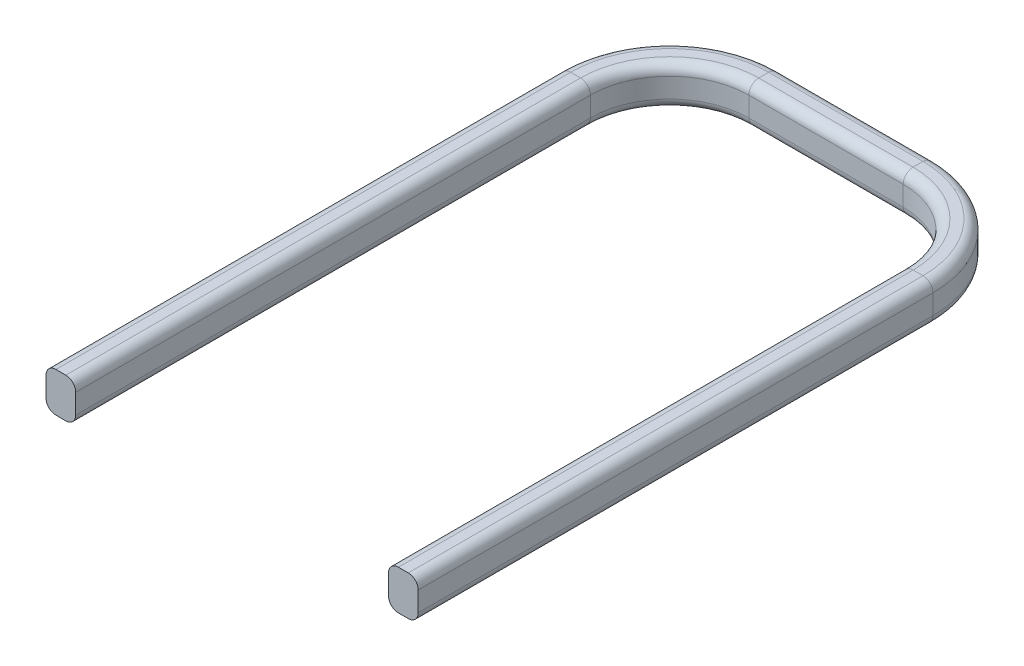
ISO-10303-21;
HEADER;
FILE_DESCRIPTION(('STEP AP214'),'2;1');
FILE_NAME('part.step','',(''),(''),'','','');
FILE_SCHEMA(('AUTOMOTIVE_DESIGN { 1 0 10303 214 1 1 1 1 }'));
ENDSEC;
DATA;
#1=APPLICATION_CONTEXT('core data for automotive mechanical design processes');
#2=APPLICATION_PROTOCOL_DEFINITION('international standard','automotive_design',2000,#1);
#3=PRODUCT_CONTEXT('',#1,'mechanical');
#4=PRODUCT('Part','Part','',(#3));
#5=PRODUCT_RELATED_PRODUCT_CATEGORY('part','',(#4));
#6=PRODUCT_DEFINITION_FORMATION('','',#4);
#7=PRODUCT_DEFINITION_CONTEXT('part definition',#1,'design');
#8=PRODUCT_DEFINITION('design','',#6,#7);
#9=PRODUCT_DEFINITION_SHAPE('','',#8);
#10=(LENGTH_UNIT() NAMED_UNIT(*) SI_UNIT(.MILLI.,.METRE.));
#11=(NAMED_UNIT(*) PLANE_ANGLE_UNIT() SI_UNIT($,.RADIAN.));
#12=(NAMED_UNIT(*) SI_UNIT($,.STERADIAN.) SOLID_ANGLE_UNIT());
#13=UNCERTAINTY_MEASURE_WITH_UNIT(LENGTH_MEASURE(1.E-05),#10,'distance_accuracy_value','');
#14=(GEOMETRIC_REPRESENTATION_CONTEXT(3) GLOBAL_UNCERTAINTY_ASSIGNED_CONTEXT((#13)) GLOBAL_UNIT_ASSIGNED_CONTEXT((#10,
#11,#12)) REPRESENTATION_CONTEXT('',''));
#15=CARTESIAN_POINT('',(0.,0.,0.));
#16=DIRECTION('',(0.,0.,1.));
#17=DIRECTION('',(1.,0.,0.));
#18=AXIS2_PLACEMENT_3D('',#15,#16,#17);
#19=CARTESIAN_POINT('',(0.,0.,0.));
#20=DIRECTION('',(0.,0.,1.));
#21=DIRECTION('',(1.,0.,0.));
#22=AXIS2_PLACEMENT_3D('',#19,#20,#21);
#23=PLANE('',#22);
#24=DIRECTION('',(0.,-1.,0.));
#25=VECTOR('',#24,1.);
#26=CARTESIAN_POINT('',(-4.7,0.,0.));
#27=LINE('',#26,#25);
#28=CARTESIAN_POINT('',(-4.7,0.75,0.));
#29=VERTEX_POINT('',#28);
#30=CARTESIAN_POINT('',(-4.7,0.25,0.));
#31=VERTEX_POINT('',#30);
#32=EDGE_CURVE('E485',#29,#31,#27,.T.);
#33=ORIENTED_EDGE('',*,*,#32,.T.);
#34=CARTESIAN_POINT('',(-4.45,0.25,0.));
#35=DIRECTION('',(0.,0.,1.));
#36=DIRECTION('',(1.,0.,0.));
#37=AXIS2_PLACEMENT_3D('',#34,#35,#36);
#38=CIRCLE('',#37,0.25);
#39=CARTESIAN_POINT('',(-4.45,0.,0.));
#40=VERTEX_POINT('',#39);
#41=EDGE_CURVE('E295',#31,#40,#38,.T.);
#42=ORIENTED_EDGE('',*,*,#41,.T.);
#43=DIRECTION('',(1.,0.,0.));
#44=VECTOR('',#43,1.);
#45=CARTESIAN_POINT('',(-3.95,0.,0.));
#46=LINE('',#45,#44);
#47=CARTESIAN_POINT('',(-4.2,0.,0.));
#48=VERTEX_POINT('',#47);
#49=EDGE_CURVE('E236',#40,#48,#46,.T.);
#50=ORIENTED_EDGE('',*,*,#49,.T.);
#51=CARTESIAN_POINT('',(-4.2,0.25,0.));
#52=DIRECTION('',(0.,0.,1.));
#53=DIRECTION('',(1.,0.,0.));
#54=AXIS2_PLACEMENT_3D('',#51,#52,#53);
#55=CIRCLE('',#54,0.25);
#56=CARTESIAN_POINT('',(-3.95,0.25,0.));
#57=VERTEX_POINT('',#56);
#58=EDGE_CURVE('E292',#48,#57,#55,.T.);
#59=ORIENTED_EDGE('',*,*,#58,.T.);
#60=DIRECTION('',(0.,1.,0.));
#61=VECTOR('',#60,1.);
#62=CARTESIAN_POINT('',(-3.95,0.,0.));
#63=LINE('',#62,#61);
#64=CARTESIAN_POINT('',(-3.95,0.75,0.));
#65=VERTEX_POINT('',#64);
#66=EDGE_CURVE('E421',#57,#65,#63,.T.);
#67=ORIENTED_EDGE('',*,*,#66,.T.);
#68=CARTESIAN_POINT('',(-4.2,0.75,0.));
#69=DIRECTION('',(0.,0.,1.));
#70=DIRECTION('',(1.,0.,0.));
#71=AXIS2_PLACEMENT_3D('',#68,#69,#70);
#72=CIRCLE('',#71,0.25);
#73=CARTESIAN_POINT('',(-4.2,1.,0.));
#74=VERTEX_POINT('',#73);
#75=EDGE_CURVE('E289',#65,#74,#72,.T.);
#76=ORIENTED_EDGE('',*,*,#75,.T.);
#77=DIRECTION('',(-1.,0.,0.));
#78=VECTOR('',#77,1.);
#79=CARTESIAN_POINT('',(-3.95,1.,0.));
#80=LINE('',#79,#78);
#81=CARTESIAN_POINT('',(-4.45,1.,0.));
#82=VERTEX_POINT('',#81);
#83=EDGE_CURVE('E478',#74,#82,#80,.T.);
#84=ORIENTED_EDGE('',*,*,#83,.T.);
#85=CARTESIAN_POINT('',(-4.45,0.75,0.));
#86=DIRECTION('',(0.,0.,1.));
#87=DIRECTION('',(1.,0.,0.));
#88=AXIS2_PLACEMENT_3D('',#85,#86,#87);
#89=CIRCLE('',#88,0.25);
#90=EDGE_CURVE('E286',#82,#29,#89,.T.);
#91=ORIENTED_EDGE('',*,*,#90,.T.);
#92=EDGE_LOOP('',(#33,#42,#50,#59,#67,#76,#84,#91));
#93=FACE_BOUND('',#92,.T.);
#94=ADVANCED_FACE('F39',(#93),#23,.T.);
#95=CARTESIAN_POINT('',(0.,0.,0.));
#96=DIRECTION('',(0.,0.,-1.));
#97=DIRECTION('',(-1.,0.,0.));
#98=AXIS2_PLACEMENT_3D('',#95,#96,#97);
#99=PLANE('',#98);
#100=DIRECTION('',(1.,0.,0.));
#101=VECTOR('',#100,1.);
#102=CARTESIAN_POINT('',(3.95,1.,0.));
#103=LINE('',#102,#101);
#104=CARTESIAN_POINT('',(4.2,1.,0.));
#105=VERTEX_POINT('',#104);
#106=CARTESIAN_POINT('',(4.45,1.,0.));
#107=VERTEX_POINT('',#106);
#108=EDGE_CURVE('E507',#105,#107,#103,.T.);
#109=ORIENTED_EDGE('',*,*,#108,.F.);
#110=CARTESIAN_POINT('',(4.2,0.75,0.));
#111=DIRECTION('',(0.,0.,-1.));
#112=DIRECTION('',(-1.,0.,0.));
#113=AXIS2_PLACEMENT_3D('',#110,#111,#112);
#114=CIRCLE('',#113,0.25);
#115=CARTESIAN_POINT('',(3.95,0.75,0.));
#116=VERTEX_POINT('',#115);
#117=EDGE_CURVE('E370',#105,#116,#114,.F.);
#118=ORIENTED_EDGE('',*,*,#117,.T.);
#119=DIRECTION('',(0.,1.,0.));
#120=VECTOR('',#119,1.);
#121=CARTESIAN_POINT('',(3.95,0.,0.));
#122=LINE('',#121,#120);
#123=CARTESIAN_POINT('',(3.95,0.25,0.));
#124=VERTEX_POINT('',#123);
#125=EDGE_CURVE('E273',#124,#116,#122,.T.);
#126=ORIENTED_EDGE('',*,*,#125,.F.);
#127=CARTESIAN_POINT('',(4.2,0.25,0.));
#128=DIRECTION('',(0.,0.,-1.));
#129=DIRECTION('',(-1.,0.,0.));
#130=AXIS2_PLACEMENT_3D('',#127,#128,#129);
#131=CIRCLE('',#130,0.25);
#132=CARTESIAN_POINT('',(4.2,0.,0.));
#133=VERTEX_POINT('',#132);
#134=EDGE_CURVE('E361',#124,#133,#131,.F.);
#135=ORIENTED_EDGE('',*,*,#134,.T.);
#136=DIRECTION('',(-1.,0.,0.));
#137=VECTOR('',#136,1.);
#138=CARTESIAN_POINT('',(3.95,0.,0.));
#139=LINE('',#138,#137);
#140=CARTESIAN_POINT('',(4.45,0.,0.));
#141=VERTEX_POINT('',#140);
#142=EDGE_CURVE('E275',#141,#133,#139,.T.);
#143=ORIENTED_EDGE('',*,*,#142,.F.);
#144=CARTESIAN_POINT('',(4.45,0.25,0.));
#145=DIRECTION('',(0.,0.,-1.));
#146=DIRECTION('',(-1.,0.,0.));
#147=AXIS2_PLACEMENT_3D('',#144,#145,#146);
#148=CIRCLE('',#147,0.25);
#149=CARTESIAN_POINT('',(4.7,0.25,0.));
#150=VERTEX_POINT('',#149);
#151=EDGE_CURVE('E364',#141,#150,#148,.F.);
#152=ORIENTED_EDGE('',*,*,#151,.T.);
#153=DIRECTION('',(0.,-1.,0.));
#154=VECTOR('',#153,1.);
#155=CARTESIAN_POINT('',(4.7,0.,0.));
#156=LINE('',#155,#154);
#157=CARTESIAN_POINT('',(4.7,0.75,0.));
#158=VERTEX_POINT('',#157);
#159=EDGE_CURVE('E279',#158,#150,#156,.T.);
#160=ORIENTED_EDGE('',*,*,#159,.F.);
#161=CARTESIAN_POINT('',(4.45,0.75,0.));
#162=DIRECTION('',(0.,0.,-1.));
#163=DIRECTION('',(-1.,0.,0.));
#164=AXIS2_PLACEMENT_3D('',#161,#162,#163);
#165=CIRCLE('',#164,0.25);
#166=EDGE_CURVE('E367',#158,#107,#165,.F.);
#167=ORIENTED_EDGE('',*,*,#166,.T.);
#168=EDGE_LOOP('',(#109,#118,#126,#135,#143,#152,#160,#167));
#169=FACE_BOUND('',#168,.T.);
#170=ADVANCED_FACE('F556',(#169),#99,.F.);
#171=CARTESIAN_POINT('',(-3.95,0.,0.));
#172=DIRECTION('',(-1.,0.,0.));
#173=DIRECTION('',(0.,0.,1.));
#174=AXIS2_PLACEMENT_3D('',#171,#172,#173);
#175=PLANE('',#174);
#176=ORIENTED_EDGE('',*,*,#66,.F.);
#177=DIRECTION('',(0.,0.,-1.));
#178=VECTOR('',#177,1.);
#179=CARTESIAN_POINT('',(-3.95,0.25,0.));
#180=LINE('',#179,#178);
#181=CARTESIAN_POINT('',(-3.95,0.25,-13.));
#182=VERTEX_POINT('',#181);
#183=EDGE_CURVE('E332',#57,#182,#180,.T.);
#184=ORIENTED_EDGE('',*,*,#183,.T.);
#185=DIRECTION('',(0.,1.,0.));
#186=VECTOR('',#185,1.);
#187=CARTESIAN_POINT('',(-3.95,0.,-13.));
#188=LINE('',#187,#186);
#189=CARTESIAN_POINT('',(-3.95,0.75,-13.));
#190=VERTEX_POINT('',#189);
#191=EDGE_CURVE('E496',#182,#190,#188,.T.);
#192=ORIENTED_EDGE('',*,*,#191,.T.);
#193=DIRECTION('',(0.,0.,-1.));
#194=VECTOR('',#193,1.);
#195=CARTESIAN_POINT('',(-3.95,0.75,0.));
#196=LINE('',#195,#194);
#197=EDGE_CURVE('E329',#190,#65,#196,.F.);
#198=ORIENTED_EDGE('',*,*,#197,.T.);
#199=EDGE_LOOP('',(#176,#184,#192,#198));
#200=FACE_BOUND('',#199,.T.);
#201=ADVANCED_FACE('F595',(#200),#175,.F.);
#202=CARTESIAN_POINT('',(-3.95,1.,0.));
#203=DIRECTION('',(0.,-1.,0.));
#204=DIRECTION('',(1.,0.,0.));
#205=AXIS2_PLACEMENT_3D('',#202,#203,#204);
#206=PLANE('',#205);
#207=ORIENTED_EDGE('',*,*,#83,.F.);
#208=DIRECTION('',(0.,0.,-1.));
#209=VECTOR('',#208,1.);
#210=CARTESIAN_POINT('',(-4.2,1.,0.));
#211=LINE('',#210,#209);
#212=CARTESIAN_POINT('',(-4.2,1.,-13.));
#213=VERTEX_POINT('',#212);
#214=EDGE_CURVE('E11',#74,#213,#211,.T.);
#215=ORIENTED_EDGE('',*,*,#214,.T.);
#216=DIRECTION('',(-1.,0.,0.));
#217=VECTOR('',#216,1.);
#218=CARTESIAN_POINT('',(-3.95,1.,-13.));
#219=LINE('',#218,#217);
#220=CARTESIAN_POINT('',(-4.45,1.,-13.));
#221=VERTEX_POINT('',#220);
#222=EDGE_CURVE('E253',#213,#221,#219,.T.);
#223=ORIENTED_EDGE('',*,*,#222,.T.);
#224=DIRECTION('',(0.,0.,-1.));
#225=VECTOR('',#224,1.);
#226=CARTESIAN_POINT('',(-4.45,1.,0.));
#227=LINE('',#226,#225);
#228=EDGE_CURVE('E49',#221,#82,#227,.F.);
#229=ORIENTED_EDGE('',*,*,#228,.T.);
#230=EDGE_LOOP('',(#207,#215,#223,#229));
#231=FACE_BOUND('',#230,.T.);
#232=ADVANCED_FACE('F477',(#231),#206,.F.);
#233=CARTESIAN_POINT('',(-4.7,0.,0.));
#234=DIRECTION('',(1.,0.,0.));
#235=DIRECTION('',(0.,0.,-1.));
#236=AXIS2_PLACEMENT_3D('',#233,#234,#235);
#237=PLANE('',#236);
#238=DIRECTION('',(0.,-1.,0.));
#239=VECTOR('',#238,1.);
#240=CARTESIAN_POINT('',(-4.7,0.,-13.));
#241=LINE('',#240,#239);
#242=CARTESIAN_POINT('',(-4.7,0.75,-13.));
#243=VERTEX_POINT('',#242);
#244=CARTESIAN_POINT('',(-4.7,0.25,-13.));
#245=VERTEX_POINT('',#244);
#246=EDGE_CURVE('E245',#243,#245,#241,.T.);
#247=ORIENTED_EDGE('',*,*,#246,.T.);
#248=DIRECTION('',(0.,0.,-1.));
#249=VECTOR('',#248,1.);
#250=CARTESIAN_POINT('',(-4.7,0.25,0.));
#251=LINE('',#250,#249);
#252=EDGE_CURVE('E210',#245,#31,#251,.F.);
#253=ORIENTED_EDGE('',*,*,#252,.T.);
#254=ORIENTED_EDGE('',*,*,#32,.F.);
#255=DIRECTION('',(0.,0.,-1.));
#256=VECTOR('',#255,1.);
#257=CARTESIAN_POINT('',(-4.7,0.75,0.));
#258=LINE('',#257,#256);
#259=EDGE_CURVE('E238',#29,#243,#258,.T.);
#260=ORIENTED_EDGE('',*,*,#259,.T.);
#261=EDGE_LOOP('',(#247,#253,#254,#260));
#262=FACE_BOUND('',#261,.T.);
#263=ADVANCED_FACE('F644',(#262),#237,.F.);
#264=CARTESIAN_POINT('',(-3.95,0.,0.));
#265=DIRECTION('',(0.,1.,0.));
#266=DIRECTION('',(-1.,0.,0.));
#267=AXIS2_PLACEMENT_3D('',#264,#265,#266);
#268=PLANE('',#267);
#269=ORIENTED_EDGE('',*,*,#49,.F.);
#270=DIRECTION('',(0.,0.,-1.));
#271=VECTOR('',#270,1.);
#272=CARTESIAN_POINT('',(-4.45,0.,0.));
#273=LINE('',#272,#271);
#274=CARTESIAN_POINT('',(-4.45,0.,-13.));
#275=VERTEX_POINT('',#274);
#276=EDGE_CURVE('E209',#40,#275,#273,.T.);
#277=ORIENTED_EDGE('',*,*,#276,.T.);
#278=DIRECTION('',(1.,0.,0.));
#279=VECTOR('',#278,1.);
#280=CARTESIAN_POINT('',(-3.95,0.,-13.));
#281=LINE('',#280,#279);
#282=CARTESIAN_POINT('',(-4.2,0.,-13.));
#283=VERTEX_POINT('',#282);
#284=EDGE_CURVE('E233',#275,#283,#281,.T.);
#285=ORIENTED_EDGE('',*,*,#284,.T.);
#286=DIRECTION('',(0.,0.,-1.));
#287=VECTOR('',#286,1.);
#288=CARTESIAN_POINT('',(-4.2,0.,0.));
#289=LINE('',#288,#287);
#290=EDGE_CURVE('E239',#283,#48,#289,.F.);
#291=ORIENTED_EDGE('',*,*,#290,.T.);
#292=EDGE_LOOP('',(#269,#277,#285,#291));
#293=FACE_BOUND('',#292,.T.);
#294=ADVANCED_FACE('F232',(#293),#268,.F.);
#295=CARTESIAN_POINT('',(-1.95,0.,-13.));
#296=DIRECTION('',(0.,-1.,0.));
#297=DIRECTION('',(0.,0.,-1.));
#298=AXIS2_PLACEMENT_3D('',#295,#296,#297);
#299=CYLINDRICAL_SURFACE('',#298,2.);
#300=ORIENTED_EDGE('',*,*,#191,.F.);
#301=CARTESIAN_POINT('',(-1.95,0.25,-13.));
#302=DIRECTION('',(0.,1.,0.));
#303=DIRECTION('',(0.,0.,1.));
#304=AXIS2_PLACEMENT_3D('',#301,#302,#303);
#305=CIRCLE('',#304,2.);
#306=CARTESIAN_POINT('',(-1.94999999999999,0.25,-15.));
#307=VERTEX_POINT('',#306);
#308=EDGE_CURVE('E339',#182,#307,#305,.F.);
#309=ORIENTED_EDGE('',*,*,#308,.T.);
#310=DIRECTION('',(0.,1.,0.));
#311=VECTOR('',#310,1.);
#312=CARTESIAN_POINT('',(-1.94999999999999,0.,-15.));
#313=LINE('',#312,#311);
#314=CARTESIAN_POINT('',(-1.94999999999999,0.75,-15.));
#315=VERTEX_POINT('',#314);
#316=EDGE_CURVE('E244',#307,#315,#313,.T.);
#317=ORIENTED_EDGE('',*,*,#316,.T.);
#318=CARTESIAN_POINT('',(-1.95,0.75,-13.));
#319=DIRECTION('',(0.,-1.,0.));
#320=DIRECTION('',(0.,0.,-1.));
#321=AXIS2_PLACEMENT_3D('',#318,#319,#320);
#322=CIRCLE('',#321,2.);
#323=EDGE_CURVE('E336',#315,#190,#322,.F.);
#324=ORIENTED_EDGE('',*,*,#323,.T.);
#325=EDGE_LOOP('',(#300,#309,#317,#324));
#326=FACE_BOUND('',#325,.T.);
#327=ADVANCED_FACE('F597',(#326),#299,.F.);
#328=CARTESIAN_POINT('',(-3.95,1.,-13.));
#329=DIRECTION('',(0.,-1.,0.));
#330=DIRECTION('',(0.,0.,-1.));
#331=AXIS2_PLACEMENT_3D('',#328,#329,#330);
#332=PLANE('',#331);
#333=ORIENTED_EDGE('',*,*,#222,.F.);
#334=CARTESIAN_POINT('',(-1.95,1.,-13.));
#335=DIRECTION('',(0.,-1.,0.));
#336=DIRECTION('',(0.,0.,-1.));
#337=AXIS2_PLACEMENT_3D('',#334,#335,#336);
#338=CIRCLE('',#337,2.25);
#339=CARTESIAN_POINT('',(-1.94999999999999,1.,-15.25));
#340=VERTEX_POINT('',#339);
#341=EDGE_CURVE('E393',#213,#340,#338,.T.);
#342=ORIENTED_EDGE('',*,*,#341,.T.);
#343=DIRECTION('',(0.,0.,-1.));
#344=VECTOR('',#343,1.);
#345=CARTESIAN_POINT('',(-1.94999999999999,1.,-15.));
#346=LINE('',#345,#344);
#347=CARTESIAN_POINT('',(-1.94999999999998,1.,-15.5));
#348=VERTEX_POINT('',#347);
#349=EDGE_CURVE('E250',#340,#348,#346,.T.);
#350=ORIENTED_EDGE('',*,*,#349,.T.);
#351=CARTESIAN_POINT('',(-1.95,1.,-13.));
#352=DIRECTION('',(0.,-1.,0.));
#353=DIRECTION('',(0.,0.,-1.));
#354=AXIS2_PLACEMENT_3D('',#351,#352,#353);
#355=CIRCLE('',#354,2.5);
#356=EDGE_CURVE('E57',#348,#221,#355,.F.);
#357=ORIENTED_EDGE('',*,*,#356,.T.);
#358=EDGE_LOOP('',(#333,#342,#350,#357));
#359=FACE_BOUND('',#358,.T.);
#360=ADVANCED_FACE('F882',(#359),#332,.F.);
#361=CARTESIAN_POINT('',(-1.95,0.,-13.));
#362=DIRECTION('',(0.,-1.,0.));
#363=DIRECTION('',(0.,0.,-1.));
#364=AXIS2_PLACEMENT_3D('',#361,#362,#363);
#365=CYLINDRICAL_SURFACE('',#364,2.75);
#366=DIRECTION('',(0.,-1.,0.));
#367=VECTOR('',#366,1.);
#368=CARTESIAN_POINT('',(-1.94999999999998,0.,-15.75));
#369=LINE('',#368,#367);
#370=CARTESIAN_POINT('',(-1.94999999999998,0.75,-15.75));
#371=VERTEX_POINT('',#370);
#372=CARTESIAN_POINT('',(-1.94999999999998,0.25,-15.75));
#373=VERTEX_POINT('',#372);
#374=EDGE_CURVE('E262',#371,#373,#369,.T.);
#375=ORIENTED_EDGE('',*,*,#374,.T.);
#376=CARTESIAN_POINT('',(-1.95,0.25,-13.));
#377=DIRECTION('',(0.,1.,0.));
#378=DIRECTION('',(0.,0.,1.));
#379=AXIS2_PLACEMENT_3D('',#376,#377,#378);
#380=CIRCLE('',#379,2.75);
#381=EDGE_CURVE('E302',#373,#245,#380,.T.);
#382=ORIENTED_EDGE('',*,*,#381,.T.);
#383=ORIENTED_EDGE('',*,*,#246,.F.);
#384=CARTESIAN_POINT('',(-1.95,0.75,-13.));
#385=DIRECTION('',(0.,-1.,0.));
#386=DIRECTION('',(0.,0.,-1.));
#387=AXIS2_PLACEMENT_3D('',#384,#385,#386);
#388=CIRCLE('',#387,2.75);
#389=EDGE_CURVE('E226',#243,#371,#388,.T.);
#390=ORIENTED_EDGE('',*,*,#389,.T.);
#391=EDGE_LOOP('',(#375,#382,#383,#390));
#392=FACE_BOUND('',#391,.T.);
#393=ADVANCED_FACE('F642',(#392),#365,.T.);
#394=CARTESIAN_POINT('',(-3.95,0.,-13.));
#395=DIRECTION('',(0.,1.,0.));
#396=DIRECTION('',(0.,0.,1.));
#397=AXIS2_PLACEMENT_3D('',#394,#395,#396);
#398=PLANE('',#397);
#399=ORIENTED_EDGE('',*,*,#284,.F.);
#400=CARTESIAN_POINT('',(-1.95,0.,-13.));
#401=DIRECTION('',(0.,1.,0.));
#402=DIRECTION('',(0.,0.,1.));
#403=AXIS2_PLACEMENT_3D('',#400,#401,#402);
#404=CIRCLE('',#403,2.5);
#405=CARTESIAN_POINT('',(-1.94999999999998,0.,-15.5));
#406=VERTEX_POINT('',#405);
#407=EDGE_CURVE('E218',#275,#406,#404,.F.);
#408=ORIENTED_EDGE('',*,*,#407,.T.);
#409=DIRECTION('',(0.,0.,1.));
#410=VECTOR('',#409,1.);
#411=CARTESIAN_POINT('',(-1.94999999999999,0.,-15.));
#412=LINE('',#411,#410);
#413=CARTESIAN_POINT('',(-1.94999999999999,0.,-15.25));
#414=VERTEX_POINT('',#413);
#415=EDGE_CURVE('E258',#406,#414,#412,.T.);
#416=ORIENTED_EDGE('',*,*,#415,.T.);
#417=CARTESIAN_POINT('',(-1.95,0.,-13.));
#418=DIRECTION('',(0.,1.,0.));
#419=DIRECTION('',(0.,0.,1.));
#420=AXIS2_PLACEMENT_3D('',#417,#418,#419);
#421=CIRCLE('',#420,2.25);
#422=EDGE_CURVE('E227',#414,#283,#421,.T.);
#423=ORIENTED_EDGE('',*,*,#422,.T.);
#424=EDGE_LOOP('',(#399,#408,#416,#423));
#425=FACE_BOUND('',#424,.T.);
#426=ADVANCED_FACE('F241',(#425),#398,.F.);
#427=CARTESIAN_POINT('',(-1.94999999999999,0.,-15.));
#428=DIRECTION('',(0.,0.,-1.));
#429=DIRECTION('',(-1.,0.,0.));
#430=AXIS2_PLACEMENT_3D('',#427,#428,#429);
#431=PLANE('',#430);
#432=ORIENTED_EDGE('',*,*,#316,.F.);
#433=DIRECTION('',(1.,0.,0.));
#434=VECTOR('',#433,1.);
#435=CARTESIAN_POINT('',(-1.94999999999999,0.25,-15.));
#436=LINE('',#435,#434);
#437=CARTESIAN_POINT('',(1.95,0.25,-15.));
#438=VERTEX_POINT('',#437);
#439=EDGE_CURVE('E345',#307,#438,#436,.T.);
#440=ORIENTED_EDGE('',*,*,#439,.T.);
#441=DIRECTION('',(0.,1.,0.));
#442=VECTOR('',#441,1.);
#443=CARTESIAN_POINT('',(1.95,0.,-15.));
#444=LINE('',#443,#442);
#445=CARTESIAN_POINT('',(1.95,0.75,-15.));
#446=VERTEX_POINT('',#445);
#447=EDGE_CURVE('E261',#438,#446,#444,.T.);
#448=ORIENTED_EDGE('',*,*,#447,.T.);
#449=DIRECTION('',(1.,0.,0.));
#450=VECTOR('',#449,1.);
#451=CARTESIAN_POINT('',(-1.94999999999999,0.75,-15.));
#452=LINE('',#451,#450);
#453=EDGE_CURVE('E342',#446,#315,#452,.F.);
#454=ORIENTED_EDGE('',*,*,#453,.T.);
#455=EDGE_LOOP('',(#432,#440,#448,#454));
#456=FACE_BOUND('',#455,.T.);
#457=ADVANCED_FACE('F857',(#456),#431,.F.);
#458=CARTESIAN_POINT('',(-1.94999999999999,1.,-15.));
#459=DIRECTION('',(0.,-1.,0.));
#460=DIRECTION('',(0.,0.,-1.));
#461=AXIS2_PLACEMENT_3D('',#458,#459,#460);
#462=PLANE('',#461);
#463=ORIENTED_EDGE('',*,*,#349,.F.);
#464=DIRECTION('',(1.,0.,0.));
#465=VECTOR('',#464,1.);
#466=CARTESIAN_POINT('',(-1.94999999999999,1.,-15.25));
#467=LINE('',#466,#465);
#468=CARTESIAN_POINT('',(1.95,1.,-15.25));
#469=VERTEX_POINT('',#468);
#470=EDGE_CURVE('E388',#340,#469,#467,.T.);
#471=ORIENTED_EDGE('',*,*,#470,.T.);
#472=DIRECTION('',(0.,0.,-1.));
#473=VECTOR('',#472,1.);
#474=CARTESIAN_POINT('',(1.95,1.,-15.));
#475=LINE('',#474,#473);
#476=CARTESIAN_POINT('',(1.95,1.,-15.5));
#477=VERTEX_POINT('',#476);
#478=EDGE_CURVE('E499',#469,#477,#475,.T.);
#479=ORIENTED_EDGE('',*,*,#478,.T.);
#480=DIRECTION('',(1.,0.,0.));
#481=VECTOR('',#480,1.);
#482=CARTESIAN_POINT('',(-1.94999999999999,1.,-15.5));
#483=LINE('',#482,#481);
#484=EDGE_CURVE('E385',#477,#348,#483,.F.);
#485=ORIENTED_EDGE('',*,*,#484,.T.);
#486=EDGE_LOOP('',(#463,#471,#479,#485));
#487=FACE_BOUND('',#486,.T.);
#488=ADVANCED_FACE('F613',(#487),#462,.F.);
#489=CARTESIAN_POINT('',(-1.94999999999999,0.,-15.75));
#490=DIRECTION('',(0.,0.,1.));
#491=DIRECTION('',(1.,0.,0.));
#492=AXIS2_PLACEMENT_3D('',#489,#490,#491);
#493=PLANE('',#492);
#494=DIRECTION('',(0.,-1.,0.));
#495=VECTOR('',#494,1.);
#496=CARTESIAN_POINT('',(1.95,0.,-15.75));
#497=LINE('',#496,#495);
#498=CARTESIAN_POINT('',(1.95,0.75,-15.75));
#499=VERTEX_POINT('',#498);
#500=CARTESIAN_POINT('',(1.95,0.25,-15.75));
#501=VERTEX_POINT('',#500);
#502=EDGE_CURVE('E268',#499,#501,#497,.T.);
#503=ORIENTED_EDGE('',*,*,#502,.T.);
#504=DIRECTION('',(1.,0.,0.));
#505=VECTOR('',#504,1.);
#506=CARTESIAN_POINT('',(-1.94999999999999,0.25,-15.75));
#507=LINE('',#506,#505);
#508=EDGE_CURVE('E314',#501,#373,#507,.F.);
#509=ORIENTED_EDGE('',*,*,#508,.T.);
#510=ORIENTED_EDGE('',*,*,#374,.F.);
#511=DIRECTION('',(1.,0.,0.));
#512=VECTOR('',#511,1.);
#513=CARTESIAN_POINT('',(-1.94999999999999,0.75,-15.75));
#514=LINE('',#513,#512);
#515=EDGE_CURVE('E311',#371,#499,#514,.T.);
#516=ORIENTED_EDGE('',*,*,#515,.T.);
#517=EDGE_LOOP('',(#503,#509,#510,#516));
#518=FACE_BOUND('',#517,.T.);
#519=ADVANCED_FACE('F544',(#518),#493,.F.);
#520=CARTESIAN_POINT('',(-1.94999999999999,0.,-15.));
#521=DIRECTION('',(0.,1.,0.));
#522=DIRECTION('',(0.,0.,1.));
#523=AXIS2_PLACEMENT_3D('',#520,#521,#522);
#524=PLANE('',#523);
#525=ORIENTED_EDGE('',*,*,#415,.F.);
#526=DIRECTION('',(1.,0.,0.));
#527=VECTOR('',#526,1.);
#528=CARTESIAN_POINT('',(-1.94999999999999,0.,-15.5));
#529=LINE('',#528,#527);
#530=CARTESIAN_POINT('',(1.95,0.,-15.5));
#531=VERTEX_POINT('',#530);
#532=EDGE_CURVE('E308',#406,#531,#529,.T.);
#533=ORIENTED_EDGE('',*,*,#532,.T.);
#534=DIRECTION('',(0.,0.,1.));
#535=VECTOR('',#534,1.);
#536=CARTESIAN_POINT('',(1.95,0.,-15.));
#537=LINE('',#536,#535);
#538=CARTESIAN_POINT('',(1.95,0.,-15.25));
#539=VERTEX_POINT('',#538);
#540=EDGE_CURVE('E263',#531,#539,#537,.T.);
#541=ORIENTED_EDGE('',*,*,#540,.T.);
#542=DIRECTION('',(1.,0.,0.));
#543=VECTOR('',#542,1.);
#544=CARTESIAN_POINT('',(-1.94999999999999,0.,-15.25));
#545=LINE('',#544,#543);
#546=EDGE_CURVE('E305',#539,#414,#545,.F.);
#547=ORIENTED_EDGE('',*,*,#546,.T.);
#548=EDGE_LOOP('',(#525,#533,#541,#547));
#549=FACE_BOUND('',#548,.T.);
#550=ADVANCED_FACE('F636',(#549),#524,.F.);
#551=CARTESIAN_POINT('',(1.95,0.,-13.));
#552=DIRECTION('',(0.,-1.,0.));
#553=DIRECTION('',(0.,0.,-1.));
#554=AXIS2_PLACEMENT_3D('',#551,#552,#553);
#555=CYLINDRICAL_SURFACE('',#554,2.);
#556=ORIENTED_EDGE('',*,*,#447,.F.);
#557=CARTESIAN_POINT('',(1.95,0.25,-13.));
#558=DIRECTION('',(0.,1.,0.));
#559=DIRECTION('',(0.,0.,1.));
#560=AXIS2_PLACEMENT_3D('',#557,#558,#559);
#561=CIRCLE('',#560,2.);
#562=CARTESIAN_POINT('',(3.95,0.25,-13.));
#563=VERTEX_POINT('',#562);
#564=EDGE_CURVE('E351',#438,#563,#561,.F.);
#565=ORIENTED_EDGE('',*,*,#564,.T.);
#566=DIRECTION('',(0.,1.,0.));
#567=VECTOR('',#566,1.);
#568=CARTESIAN_POINT('',(3.95,0.,-13.));
#569=LINE('',#568,#567);
#570=CARTESIAN_POINT('',(3.95,0.75,-13.));
#571=VERTEX_POINT('',#570);
#572=EDGE_CURVE('E267',#563,#571,#569,.T.);
#573=ORIENTED_EDGE('',*,*,#572,.T.);
#574=CARTESIAN_POINT('',(1.95,0.75,-13.));
#575=DIRECTION('',(0.,-1.,0.));
#576=DIRECTION('',(0.,0.,-1.));
#577=AXIS2_PLACEMENT_3D('',#574,#575,#576);
#578=CIRCLE('',#577,2.);
#579=EDGE_CURVE('E348',#571,#446,#578,.F.);
#580=ORIENTED_EDGE('',*,*,#579,.T.);
#581=EDGE_LOOP('',(#556,#565,#573,#580));
#582=FACE_BOUND('',#581,.T.);
#583=ADVANCED_FACE('F620',(#582),#555,.F.);
#584=CARTESIAN_POINT('',(1.95,1.,-15.));
#585=DIRECTION('',(0.,-1.,0.));
#586=DIRECTION('',(0.,0.,-1.));
#587=AXIS2_PLACEMENT_3D('',#584,#585,#586);
#588=PLANE('',#587);
#589=ORIENTED_EDGE('',*,*,#478,.F.);
#590=CARTESIAN_POINT('',(1.95,1.,-13.));
#591=DIRECTION('',(0.,-1.,0.));
#592=DIRECTION('',(0.,0.,-1.));
#593=AXIS2_PLACEMENT_3D('',#590,#591,#592);
#594=CIRCLE('',#593,2.25);
#595=CARTESIAN_POINT('',(4.2,1.,-13.));
#596=VERTEX_POINT('',#595);
#597=EDGE_CURVE('E382',#469,#596,#594,.T.);
#598=ORIENTED_EDGE('',*,*,#597,.T.);
#599=DIRECTION('',(1.,0.,0.));
#600=VECTOR('',#599,1.);
#601=CARTESIAN_POINT('',(3.95,1.,-13.));
#602=LINE('',#601,#600);
#603=CARTESIAN_POINT('',(4.45,1.,-13.));
#604=VERTEX_POINT('',#603);
#605=EDGE_CURVE('E503',#596,#604,#602,.T.);
#606=ORIENTED_EDGE('',*,*,#605,.T.);
#607=CARTESIAN_POINT('',(1.95,1.,-13.));
#608=DIRECTION('',(0.,-1.,0.));
#609=DIRECTION('',(0.,0.,-1.));
#610=AXIS2_PLACEMENT_3D('',#607,#608,#609);
#611=CIRCLE('',#610,2.5);
#612=EDGE_CURVE('E379',#604,#477,#611,.F.);
#613=ORIENTED_EDGE('',*,*,#612,.T.);
#614=EDGE_LOOP('',(#589,#598,#606,#613));
#615=FACE_BOUND('',#614,.T.);
#616=ADVANCED_FACE('F615',(#615),#588,.F.);
#617=CARTESIAN_POINT('',(1.95,0.,-13.));
#618=DIRECTION('',(0.,-1.,0.));
#619=DIRECTION('',(0.,0.,-1.));
#620=AXIS2_PLACEMENT_3D('',#617,#618,#619);
#621=CYLINDRICAL_SURFACE('',#620,2.75);
#622=DIRECTION('',(0.,-1.,0.));
#623=VECTOR('',#622,1.);
#624=CARTESIAN_POINT('',(4.7,0.,-13.));
#625=LINE('',#624,#623);
#626=CARTESIAN_POINT('',(4.7,0.75,-13.));
#627=VERTEX_POINT('',#626);
#628=CARTESIAN_POINT('',(4.7,0.25,-13.));
#629=VERTEX_POINT('',#628);
#630=EDGE_CURVE('E274',#627,#629,#625,.T.);
#631=ORIENTED_EDGE('',*,*,#630,.T.);
#632=CARTESIAN_POINT('',(1.95,0.25,-13.));
#633=DIRECTION('',(0.,1.,0.));
#634=DIRECTION('',(0.,0.,1.));
#635=AXIS2_PLACEMENT_3D('',#632,#633,#634);
#636=CIRCLE('',#635,2.75);
#637=EDGE_CURVE('E326',#629,#501,#636,.T.);
#638=ORIENTED_EDGE('',*,*,#637,.T.);
#639=ORIENTED_EDGE('',*,*,#502,.F.);
#640=CARTESIAN_POINT('',(1.95,0.75,-13.));
#641=DIRECTION('',(0.,-1.,0.));
#642=DIRECTION('',(0.,0.,-1.));
#643=AXIS2_PLACEMENT_3D('',#640,#641,#642);
#644=CIRCLE('',#643,2.75);
#645=EDGE_CURVE('E323',#499,#627,#644,.T.);
#646=ORIENTED_EDGE('',*,*,#645,.T.);
#647=EDGE_LOOP('',(#631,#638,#639,#646));
#648=FACE_BOUND('',#647,.T.);
#649=ADVANCED_FACE('F541',(#648),#621,.T.);
#650=CARTESIAN_POINT('',(1.95,0.,-15.));
#651=DIRECTION('',(0.,1.,0.));
#652=DIRECTION('',(0.,0.,1.));
#653=AXIS2_PLACEMENT_3D('',#650,#651,#652);
#654=PLANE('',#653);
#655=ORIENTED_EDGE('',*,*,#540,.F.);
#656=CARTESIAN_POINT('',(1.95,0.,-13.));
#657=DIRECTION('',(0.,1.,0.));
#658=DIRECTION('',(0.,0.,1.));
#659=AXIS2_PLACEMENT_3D('',#656,#657,#658);
#660=CIRCLE('',#659,2.5);
#661=CARTESIAN_POINT('',(4.45,0.,-13.));
#662=VERTEX_POINT('',#661);
#663=EDGE_CURVE('E320',#531,#662,#660,.F.);
#664=ORIENTED_EDGE('',*,*,#663,.T.);
#665=DIRECTION('',(-1.,0.,0.));
#666=VECTOR('',#665,1.);
#667=CARTESIAN_POINT('',(3.95,0.,-13.));
#668=LINE('',#667,#666);
#669=CARTESIAN_POINT('',(4.2,0.,-13.));
#670=VERTEX_POINT('',#669);
#671=EDGE_CURVE('E269',#662,#670,#668,.T.);
#672=ORIENTED_EDGE('',*,*,#671,.T.);
#673=CARTESIAN_POINT('',(1.95,0.,-13.));
#674=DIRECTION('',(0.,1.,0.));
#675=DIRECTION('',(0.,0.,1.));
#676=AXIS2_PLACEMENT_3D('',#673,#674,#675);
#677=CIRCLE('',#676,2.25);
#678=EDGE_CURVE('E317',#670,#539,#677,.T.);
#679=ORIENTED_EDGE('',*,*,#678,.T.);
#680=EDGE_LOOP('',(#655,#664,#672,#679));
#681=FACE_BOUND('',#680,.T.);
#682=ADVANCED_FACE('F633',(#681),#654,.F.);
#683=CARTESIAN_POINT('',(3.95,0.,-13.));
#684=DIRECTION('',(1.,0.,0.));
#685=DIRECTION('',(0.,0.,-1.));
#686=AXIS2_PLACEMENT_3D('',#683,#684,#685);
#687=PLANE('',#686);
#688=ORIENTED_EDGE('',*,*,#125,.T.);
#689=DIRECTION('',(0.,0.,1.));
#690=VECTOR('',#689,1.);
#691=CARTESIAN_POINT('',(3.95,0.75,-13.));
#692=LINE('',#691,#690);
#693=EDGE_CURVE('E376',#116,#571,#692,.F.);
#694=ORIENTED_EDGE('',*,*,#693,.T.);
#695=ORIENTED_EDGE('',*,*,#572,.F.);
#696=DIRECTION('',(0.,0.,1.));
#697=VECTOR('',#696,1.);
#698=CARTESIAN_POINT('',(3.95,0.25,-13.));
#699=LINE('',#698,#697);
#700=EDGE_CURVE('E373',#563,#124,#699,.T.);
#701=ORIENTED_EDGE('',*,*,#700,.T.);
#702=EDGE_LOOP('',(#688,#694,#695,#701));
#703=FACE_BOUND('',#702,.T.);
#704=ADVANCED_FACE('F569',(#703),#687,.F.);
#705=CARTESIAN_POINT('',(3.95,1.,-13.));
#706=DIRECTION('',(0.,-1.,0.));
#707=DIRECTION('',(1.,0.,0.));
#708=AXIS2_PLACEMENT_3D('',#705,#706,#707);
#709=PLANE('',#708);
#710=ORIENTED_EDGE('',*,*,#605,.F.);
#711=DIRECTION('',(0.,0.,1.));
#712=VECTOR('',#711,1.);
#713=CARTESIAN_POINT('',(4.2,1.,-13.));
#714=LINE('',#713,#712);
#715=EDGE_CURVE('E357',#596,#105,#714,.T.);
#716=ORIENTED_EDGE('',*,*,#715,.T.);
#717=ORIENTED_EDGE('',*,*,#108,.T.);
#718=DIRECTION('',(0.,0.,1.));
#719=VECTOR('',#718,1.);
#720=CARTESIAN_POINT('',(4.45,1.,-13.));
#721=LINE('',#720,#719);
#722=EDGE_CURVE('E354',#107,#604,#721,.F.);
#723=ORIENTED_EDGE('',*,*,#722,.T.);
#724=EDGE_LOOP('',(#710,#716,#717,#723));
#725=FACE_BOUND('',#724,.T.);
#726=ADVANCED_FACE('F559',(#725),#709,.F.);
#727=CARTESIAN_POINT('',(4.7,0.,-13.));
#728=DIRECTION('',(-1.,0.,0.));
#729=DIRECTION('',(0.,0.,1.));
#730=AXIS2_PLACEMENT_3D('',#727,#728,#729);
#731=PLANE('',#730);
#732=ORIENTED_EDGE('',*,*,#630,.F.);
#733=DIRECTION('',(0.,0.,1.));
#734=VECTOR('',#733,1.);
#735=CARTESIAN_POINT('',(4.7,0.75,-13.));
#736=LINE('',#735,#734);
#737=EDGE_CURVE('E399',#627,#158,#736,.T.);
#738=ORIENTED_EDGE('',*,*,#737,.T.);
#739=ORIENTED_EDGE('',*,*,#159,.T.);
#740=DIRECTION('',(0.,0.,1.));
#741=VECTOR('',#740,1.);
#742=CARTESIAN_POINT('',(4.7,0.25,-13.));
#743=LINE('',#742,#741);
#744=EDGE_CURVE('E396',#150,#629,#743,.F.);
#745=ORIENTED_EDGE('',*,*,#744,.T.);
#746=EDGE_LOOP('',(#732,#738,#739,#745));
#747=FACE_BOUND('',#746,.T.);
#748=ADVANCED_FACE('F525',(#747),#731,.F.);
#749=CARTESIAN_POINT('',(3.95,0.,-13.));
#750=DIRECTION('',(0.,1.,0.));
#751=DIRECTION('',(-1.,0.,0.));
#752=AXIS2_PLACEMENT_3D('',#749,#750,#751);
#753=PLANE('',#752);
#754=ORIENTED_EDGE('',*,*,#671,.F.);
#755=DIRECTION('',(0.,0.,1.));
#756=VECTOR('',#755,1.);
#757=CARTESIAN_POINT('',(4.45,0.,-13.));
#758=LINE('',#757,#756);
#759=EDGE_CURVE('E406',#662,#141,#758,.T.);
#760=ORIENTED_EDGE('',*,*,#759,.T.);
#761=ORIENTED_EDGE('',*,*,#142,.T.);
#762=DIRECTION('',(0.,0.,1.));
#763=VECTOR('',#762,1.);
#764=CARTESIAN_POINT('',(4.2,0.,-13.));
#765=LINE('',#764,#763);
#766=EDGE_CURVE('E403',#133,#670,#765,.F.);
#767=ORIENTED_EDGE('',*,*,#766,.T.);
#768=EDGE_LOOP('',(#754,#760,#761,#767));
#769=FACE_BOUND('',#768,.T.);
#770=ADVANCED_FACE('F655',(#769),#753,.F.);
#771=CARTESIAN_POINT('',(4.45,0.25,-13.));
#772=DIRECTION('',(0.,0.,1.));
#773=DIRECTION('',(1.,0.,0.));
#774=AXIS2_PLACEMENT_3D('',#771,#772,#773);
#775=CYLINDRICAL_SURFACE('',#774,0.25);
#776=ORIENTED_EDGE('',*,*,#151,.F.);
#777=ORIENTED_EDGE('',*,*,#759,.F.);
#778=CARTESIAN_POINT('',(4.45,0.25,-13.));
#779=DIRECTION('',(0.,0.,-1.));
#780=DIRECTION('',(-1.,0.,0.));
#781=AXIS2_PLACEMENT_3D('',#778,#779,#780);
#782=CIRCLE('',#781,0.25);
#783=EDGE_CURVE('E417',#629,#662,#782,.T.);
#784=ORIENTED_EDGE('',*,*,#783,.F.);
#785=ORIENTED_EDGE('',*,*,#744,.F.);
#786=EDGE_LOOP('',(#776,#777,#784,#785));
#787=FACE_BOUND('',#786,.T.);
#788=ADVANCED_FACE('F531',(#787),#775,.T.);
#789=CARTESIAN_POINT('',(1.95,0.25,-13.));
#790=DIRECTION('',(0.,1.,0.));
#791=DIRECTION('',(0.,0.,1.));
#792=AXIS2_PLACEMENT_3D('',#789,#790,#791);
#793=TOROIDAL_SURFACE('',#792,2.5,0.25);
#794=ORIENTED_EDGE('',*,*,#783,.T.);
#795=ORIENTED_EDGE('',*,*,#663,.F.);
#796=CARTESIAN_POINT('',(1.95,0.25,-15.5));
#797=DIRECTION('',(-1.,0.,0.));
#798=DIRECTION('',(0.,-1.,0.));
#799=AXIS2_PLACEMENT_3D('',#796,#797,#798);
#800=CIRCLE('',#799,0.25);
#801=EDGE_CURVE('E413',#501,#531,#800,.T.);
#802=ORIENTED_EDGE('',*,*,#801,.F.);
#803=ORIENTED_EDGE('',*,*,#637,.F.);
#804=EDGE_LOOP('',(#794,#795,#802,#803));
#805=FACE_BOUND('',#804,.T.);
#806=ADVANCED_FACE('F537',(#805),#793,.T.);
#807=CARTESIAN_POINT('',(-1.94999999999999,0.25,-15.5));
#808=DIRECTION('',(1.,0.,0.));
#809=DIRECTION('',(0.,0.,-1.));
#810=AXIS2_PLACEMENT_3D('',#807,#808,#809);
#811=CYLINDRICAL_SURFACE('',#810,0.25);
#812=ORIENTED_EDGE('',*,*,#801,.T.);
#813=ORIENTED_EDGE('',*,*,#532,.F.);
#814=CARTESIAN_POINT('',(-1.94999999999998,0.25,-15.5));
#815=DIRECTION('',(-1.,0.,0.));
#816=DIRECTION('',(0.,-1.,0.));
#817=AXIS2_PLACEMENT_3D('',#814,#815,#816);
#818=CIRCLE('',#817,0.25);
#819=EDGE_CURVE('E214',#373,#406,#818,.T.);
#820=ORIENTED_EDGE('',*,*,#819,.F.);
#821=ORIENTED_EDGE('',*,*,#508,.F.);
#822=EDGE_LOOP('',(#812,#813,#820,#821));
#823=FACE_BOUND('',#822,.T.);
#824=ADVANCED_FACE('F639',(#823),#811,.T.);
#825=CARTESIAN_POINT('',(-1.95,0.25,-13.));
#826=DIRECTION('',(0.,1.,0.));
#827=DIRECTION('',(0.,0.,1.));
#828=AXIS2_PLACEMENT_3D('',#825,#826,#827);
#829=TOROIDAL_SURFACE('',#828,2.5,0.25);
#830=ORIENTED_EDGE('',*,*,#819,.T.);
#831=ORIENTED_EDGE('',*,*,#407,.F.);
#832=CARTESIAN_POINT('',(-4.45,0.25,-13.));
#833=DIRECTION('',(0.,0.,1.));
#834=DIRECTION('',(1.,0.,0.));
#835=AXIS2_PLACEMENT_3D('',#832,#833,#834);
#836=CIRCLE('',#835,0.25);
#837=EDGE_CURVE('E204',#245,#275,#836,.T.);
#838=ORIENTED_EDGE('',*,*,#837,.F.);
#839=ORIENTED_EDGE('',*,*,#381,.F.);
#840=EDGE_LOOP('',(#830,#831,#838,#839));
#841=FACE_BOUND('',#840,.T.);
#842=ADVANCED_FACE('F219',(#841),#829,.T.);
#843=CARTESIAN_POINT('',(-4.45,0.25,0.));
#844=DIRECTION('',(0.,0.,-1.));
#845=DIRECTION('',(-1.,0.,0.));
#846=AXIS2_PLACEMENT_3D('',#843,#844,#845);
#847=CYLINDRICAL_SURFACE('',#846,0.25);
#848=ORIENTED_EDGE('',*,*,#41,.F.);
#849=ORIENTED_EDGE('',*,*,#252,.F.);
#850=ORIENTED_EDGE('',*,*,#837,.T.);
#851=ORIENTED_EDGE('',*,*,#276,.F.);
#852=EDGE_LOOP('',(#848,#849,#850,#851));
#853=FACE_BOUND('',#852,.T.);
#854=ADVANCED_FACE('F207',(#853),#847,.T.);
#855=CARTESIAN_POINT('',(4.2,0.25,-13.));
#856=DIRECTION('',(0.,0.,1.));
#857=DIRECTION('',(1.,0.,0.));
#858=AXIS2_PLACEMENT_3D('',#855,#856,#857);
#859=CYLINDRICAL_SURFACE('',#858,0.25);
#860=ORIENTED_EDGE('',*,*,#134,.F.);
#861=ORIENTED_EDGE('',*,*,#700,.F.);
#862=CARTESIAN_POINT('',(4.2,0.25,-13.));
#863=DIRECTION('',(0.,0.,-1.));
#864=DIRECTION('',(-1.,0.,0.));
#865=AXIS2_PLACEMENT_3D('',#862,#863,#864);
#866=CIRCLE('',#865,0.25);
#867=EDGE_CURVE('E215',#670,#563,#866,.T.);
#868=ORIENTED_EDGE('',*,*,#867,.F.);
#869=ORIENTED_EDGE('',*,*,#766,.F.);
#870=EDGE_LOOP('',(#860,#861,#868,#869));
#871=FACE_BOUND('',#870,.T.);
#872=ADVANCED_FACE('F624',(#871),#859,.T.);
#873=CARTESIAN_POINT('',(1.95,0.25,-13.));
#874=DIRECTION('',(0.,1.,0.));
#875=DIRECTION('',(0.,0.,1.));
#876=AXIS2_PLACEMENT_3D('',#873,#874,#875);
#877=TOROIDAL_SURFACE('',#876,2.25,0.25);
#878=ORIENTED_EDGE('',*,*,#867,.T.);
#879=ORIENTED_EDGE('',*,*,#564,.F.);
#880=CARTESIAN_POINT('',(1.95,0.25,-15.25));
#881=DIRECTION('',(-1.,0.,0.));
#882=DIRECTION('',(0.,0.,1.));
#883=AXIS2_PLACEMENT_3D('',#880,#881,#882);
#884=CIRCLE('',#883,0.25);
#885=EDGE_CURVE('E430',#539,#438,#884,.T.);
#886=ORIENTED_EDGE('',*,*,#885,.F.);
#887=ORIENTED_EDGE('',*,*,#678,.F.);
#888=EDGE_LOOP('',(#878,#879,#886,#887));
#889=FACE_BOUND('',#888,.T.);
#890=ADVANCED_FACE('F628',(#889),#877,.T.);
#891=CARTESIAN_POINT('',(-1.94999999999999,0.25,-15.25));
#892=DIRECTION('',(1.,0.,0.));
#893=DIRECTION('',(0.,0.,-1.));
#894=AXIS2_PLACEMENT_3D('',#891,#892,#893);
#895=CYLINDRICAL_SURFACE('',#894,0.25);
#896=ORIENTED_EDGE('',*,*,#885,.T.);
#897=ORIENTED_EDGE('',*,*,#439,.F.);
#898=CARTESIAN_POINT('',(-1.94999999999999,0.25,-15.25));
#899=DIRECTION('',(-1.,0.,0.));
#900=DIRECTION('',(0.,0.,1.));
#901=AXIS2_PLACEMENT_3D('',#898,#899,#900);
#902=CIRCLE('',#901,0.25);
#903=EDGE_CURVE('E425',#414,#307,#902,.T.);
#904=ORIENTED_EDGE('',*,*,#903,.F.);
#905=ORIENTED_EDGE('',*,*,#546,.F.);
#906=EDGE_LOOP('',(#896,#897,#904,#905));
#907=FACE_BOUND('',#906,.T.);
#908=ADVANCED_FACE('F686',(#907),#895,.T.);
#909=CARTESIAN_POINT('',(-1.95,0.25,-13.));
#910=DIRECTION('',(0.,1.,0.));
#911=DIRECTION('',(0.,0.,1.));
#912=AXIS2_PLACEMENT_3D('',#909,#910,#911);
#913=TOROIDAL_SURFACE('',#912,2.25,0.25);
#914=ORIENTED_EDGE('',*,*,#903,.T.);
#915=ORIENTED_EDGE('',*,*,#308,.F.);
#916=CARTESIAN_POINT('',(-4.2,0.25,-13.));
#917=DIRECTION('',(0.,0.,1.));
#918=DIRECTION('',(1.,0.,0.));
#919=AXIS2_PLACEMENT_3D('',#916,#917,#918);
#920=CIRCLE('',#919,0.25);
#921=EDGE_CURVE('E422',#283,#182,#920,.T.);
#922=ORIENTED_EDGE('',*,*,#921,.F.);
#923=ORIENTED_EDGE('',*,*,#422,.F.);
#924=EDGE_LOOP('',(#914,#915,#922,#923));
#925=FACE_BOUND('',#924,.T.);
#926=ADVANCED_FACE('F683',(#925),#913,.T.);
#927=CARTESIAN_POINT('',(-4.2,0.25,0.));
#928=DIRECTION('',(0.,0.,-1.));
#929=DIRECTION('',(-1.,0.,0.));
#930=AXIS2_PLACEMENT_3D('',#927,#928,#929);
#931=CYLINDRICAL_SURFACE('',#930,0.25);
#932=ORIENTED_EDGE('',*,*,#58,.F.);
#933=ORIENTED_EDGE('',*,*,#290,.F.);
#934=ORIENTED_EDGE('',*,*,#921,.T.);
#935=ORIENTED_EDGE('',*,*,#183,.F.);
#936=EDGE_LOOP('',(#932,#933,#934,#935));
#937=FACE_BOUND('',#936,.T.);
#938=ADVANCED_FACE('F592',(#937),#931,.T.);
#939=CARTESIAN_POINT('',(-4.2,0.75,0.));
#940=DIRECTION('',(0.,0.,-1.));
#941=DIRECTION('',(-1.,0.,0.));
#942=AXIS2_PLACEMENT_3D('',#939,#940,#941);
#943=CYLINDRICAL_SURFACE('',#942,0.25);
#944=ORIENTED_EDGE('',*,*,#75,.F.);
#945=ORIENTED_EDGE('',*,*,#197,.F.);
#946=CARTESIAN_POINT('',(-4.2,0.75,-13.));
#947=DIRECTION('',(0.,0.,-1.));
#948=DIRECTION('',(-1.,0.,0.));
#949=AXIS2_PLACEMENT_3D('',#946,#947,#948);
#950=CIRCLE('',#949,0.25);
#951=EDGE_CURVE('E426',#213,#190,#950,.T.);
#952=ORIENTED_EDGE('',*,*,#951,.F.);
#953=ORIENTED_EDGE('',*,*,#214,.F.);
#954=EDGE_LOOP('',(#944,#945,#952,#953));
#955=FACE_BOUND('',#954,.T.);
#956=ADVANCED_FACE('F682',(#955),#943,.T.);
#957=CARTESIAN_POINT('',(-1.95,0.75,-13.));
#958=DIRECTION('',(0.,-1.,0.));
#959=DIRECTION('',(0.,0.,-1.));
#960=AXIS2_PLACEMENT_3D('',#957,#958,#959);
#961=TOROIDAL_SURFACE('',#960,2.25,0.25);
#962=ORIENTED_EDGE('',*,*,#951,.T.);
#963=ORIENTED_EDGE('',*,*,#323,.F.);
#964=CARTESIAN_POINT('',(-1.94999999999999,0.75,-15.25));
#965=DIRECTION('',(1.,0.,0.));
#966=DIRECTION('',(0.,0.,-1.));
#967=AXIS2_PLACEMENT_3D('',#964,#965,#966);
#968=CIRCLE('',#967,0.25);
#969=EDGE_CURVE('E445',#340,#315,#968,.T.);
#970=ORIENTED_EDGE('',*,*,#969,.F.);
#971=ORIENTED_EDGE('',*,*,#341,.F.);
#972=EDGE_LOOP('',(#962,#963,#970,#971));
#973=FACE_BOUND('',#972,.T.);
#974=ADVANCED_FACE('F602',(#973),#961,.T.);
#975=CARTESIAN_POINT('',(-1.94999999999999,0.75,-15.25));
#976=DIRECTION('',(1.,0.,0.));
#977=DIRECTION('',(0.,0.,-1.));
#978=AXIS2_PLACEMENT_3D('',#975,#976,#977);
#979=CYLINDRICAL_SURFACE('',#978,0.25);
#980=ORIENTED_EDGE('',*,*,#969,.T.);
#981=ORIENTED_EDGE('',*,*,#453,.F.);
#982=CARTESIAN_POINT('',(1.95,0.75,-15.25));
#983=DIRECTION('',(1.,0.,0.));
#984=DIRECTION('',(0.,0.,-1.));
#985=AXIS2_PLACEMENT_3D('',#982,#983,#984);
#986=CIRCLE('',#985,0.25);
#987=EDGE_CURVE('E441',#469,#446,#986,.T.);
#988=ORIENTED_EDGE('',*,*,#987,.F.);
#989=ORIENTED_EDGE('',*,*,#470,.F.);
#990=EDGE_LOOP('',(#980,#981,#988,#989));
#991=FACE_BOUND('',#990,.T.);
#992=ADVANCED_FACE('F607',(#991),#979,.T.);
#993=CARTESIAN_POINT('',(1.95,0.75,-13.));
#994=DIRECTION('',(0.,-1.,0.));
#995=DIRECTION('',(0.,0.,-1.));
#996=AXIS2_PLACEMENT_3D('',#993,#994,#995);
#997=TOROIDAL_SURFACE('',#996,2.25,0.25);
#998=ORIENTED_EDGE('',*,*,#987,.T.);
#999=ORIENTED_EDGE('',*,*,#579,.F.);
#1000=CARTESIAN_POINT('',(4.2,0.75,-13.));
#1001=DIRECTION('',(0.,0.,1.));
#1002=DIRECTION('',(1.,0.,0.));
#1003=AXIS2_PLACEMENT_3D('',#1000,#1001,#1002);
#1004=CIRCLE('',#1003,0.25);
#1005=EDGE_CURVE('E437',#596,#571,#1004,.T.);
#1006=ORIENTED_EDGE('',*,*,#1005,.F.);
#1007=ORIENTED_EDGE('',*,*,#597,.F.);
#1008=EDGE_LOOP('',(#998,#999,#1006,#1007));
#1009=FACE_BOUND('',#1008,.T.);
#1010=ADVANCED_FACE('F617',(#1009),#997,.T.);
#1011=CARTESIAN_POINT('',(4.2,0.75,-13.));
#1012=DIRECTION('',(0.,0.,1.));
#1013=DIRECTION('',(1.,0.,0.));
#1014=AXIS2_PLACEMENT_3D('',#1011,#1012,#1013);
#1015=CYLINDRICAL_SURFACE('',#1014,0.25);
#1016=ORIENTED_EDGE('',*,*,#1005,.T.);
#1017=ORIENTED_EDGE('',*,*,#693,.F.);
#1018=ORIENTED_EDGE('',*,*,#117,.F.);
#1019=ORIENTED_EDGE('',*,*,#715,.F.);
#1020=EDGE_LOOP('',(#1016,#1017,#1018,#1019));
#1021=FACE_BOUND('',#1020,.T.);
#1022=ADVANCED_FACE('F563',(#1021),#1015,.T.);
#1023=CARTESIAN_POINT('',(-4.45,0.75,0.));
#1024=DIRECTION('',(0.,0.,-1.));
#1025=DIRECTION('',(-1.,0.,0.));
#1026=AXIS2_PLACEMENT_3D('',#1023,#1024,#1025);
#1027=CYLINDRICAL_SURFACE('',#1026,0.25);
#1028=ORIENTED_EDGE('',*,*,#90,.F.);
#1029=ORIENTED_EDGE('',*,*,#228,.F.);
#1030=CARTESIAN_POINT('',(-4.45,0.75,-13.));
#1031=DIRECTION('',(0.,0.,-1.));
#1032=DIRECTION('',(-1.,0.,0.));
#1033=AXIS2_PLACEMENT_3D('',#1030,#1031,#1032);
#1034=CIRCLE('',#1033,0.25);
#1035=EDGE_CURVE('E43',#243,#221,#1034,.T.);
#1036=ORIENTED_EDGE('',*,*,#1035,.F.);
#1037=ORIENTED_EDGE('',*,*,#259,.F.);
#1038=EDGE_LOOP('',(#1028,#1029,#1036,#1037));
#1039=FACE_BOUND('',#1038,.T.);
#1040=ADVANCED_FACE('F41',(#1039),#1027,.T.);
#1041=CARTESIAN_POINT('',(-1.95,0.75,-13.));
#1042=DIRECTION('',(0.,-1.,0.));
#1043=DIRECTION('',(0.,0.,-1.));
#1044=AXIS2_PLACEMENT_3D('',#1041,#1042,#1043);
#1045=TOROIDAL_SURFACE('',#1044,2.5,0.25);
#1046=ORIENTED_EDGE('',*,*,#1035,.T.);
#1047=ORIENTED_EDGE('',*,*,#356,.F.);
#1048=CARTESIAN_POINT('',(-1.94999999999998,0.75,-15.5));
#1049=DIRECTION('',(1.,0.,0.));
#1050=DIRECTION('',(0.,0.,-1.));
#1051=AXIS2_PLACEMENT_3D('',#1048,#1049,#1050);
#1052=CIRCLE('',#1051,0.25);
#1053=EDGE_CURVE('E459',#371,#348,#1052,.T.);
#1054=ORIENTED_EDGE('',*,*,#1053,.F.);
#1055=ORIENTED_EDGE('',*,*,#389,.F.);
#1056=EDGE_LOOP('',(#1046,#1047,#1054,#1055));
#1057=FACE_BOUND('',#1056,.T.);
#1058=ADVANCED_FACE('F471',(#1057),#1045,.T.);
#1059=CARTESIAN_POINT('',(-1.94999999999999,0.75,-15.5));
#1060=DIRECTION('',(1.,0.,0.));
#1061=DIRECTION('',(0.,0.,-1.));
#1062=AXIS2_PLACEMENT_3D('',#1059,#1060,#1061);
#1063=CYLINDRICAL_SURFACE('',#1062,0.25);
#1064=ORIENTED_EDGE('',*,*,#1053,.T.);
#1065=ORIENTED_EDGE('',*,*,#484,.F.);
#1066=CARTESIAN_POINT('',(1.95,0.75,-15.5));
#1067=DIRECTION('',(1.,0.,0.));
#1068=DIRECTION('',(0.,0.,-1.));
#1069=AXIS2_PLACEMENT_3D('',#1066,#1067,#1068);
#1070=CIRCLE('',#1069,0.25);
#1071=EDGE_CURVE('E456',#499,#477,#1070,.T.);
#1072=ORIENTED_EDGE('',*,*,#1071,.F.);
#1073=ORIENTED_EDGE('',*,*,#515,.F.);
#1074=EDGE_LOOP('',(#1064,#1065,#1072,#1073));
#1075=FACE_BOUND('',#1074,.T.);
#1076=ADVANCED_FACE('F546',(#1075),#1063,.T.);
#1077=CARTESIAN_POINT('',(1.95,0.75,-13.));
#1078=DIRECTION('',(0.,-1.,0.));
#1079=DIRECTION('',(0.,0.,-1.));
#1080=AXIS2_PLACEMENT_3D('',#1077,#1078,#1079);
#1081=TOROIDAL_SURFACE('',#1080,2.5,0.25);
#1082=ORIENTED_EDGE('',*,*,#1071,.T.);
#1083=ORIENTED_EDGE('',*,*,#612,.F.);
#1084=CARTESIAN_POINT('',(4.45,0.75,-13.));
#1085=DIRECTION('',(0.,0.,1.));
#1086=DIRECTION('',(1.,0.,0.));
#1087=AXIS2_PLACEMENT_3D('',#1084,#1085,#1086);
#1088=CIRCLE('',#1087,0.25);
#1089=EDGE_CURVE('E452',#627,#604,#1088,.T.);
#1090=ORIENTED_EDGE('',*,*,#1089,.F.);
#1091=ORIENTED_EDGE('',*,*,#645,.F.);
#1092=EDGE_LOOP('',(#1082,#1083,#1090,#1091));
#1093=FACE_BOUND('',#1092,.T.);
#1094=ADVANCED_FACE('F551',(#1093),#1081,.T.);
#1095=CARTESIAN_POINT('',(4.45,0.75,-13.));
#1096=DIRECTION('',(0.,0.,1.));
#1097=DIRECTION('',(1.,0.,0.));
#1098=AXIS2_PLACEMENT_3D('',#1095,#1096,#1097);
#1099=CYLINDRICAL_SURFACE('',#1098,0.25);
#1100=ORIENTED_EDGE('',*,*,#1089,.T.);
#1101=ORIENTED_EDGE('',*,*,#722,.F.);
#1102=ORIENTED_EDGE('',*,*,#166,.F.);
#1103=ORIENTED_EDGE('',*,*,#737,.F.);
#1104=EDGE_LOOP('',(#1100,#1101,#1102,#1103));
#1105=FACE_BOUND('',#1104,.T.);
#1106=ADVANCED_FACE('F554',(#1105),#1099,.T.);
#1107=CLOSED_SHELL('',(#94,#170,#201,#232,#263,#294,#327,#360,#393,#426,#457,#488,#519,#550,
#583,#616,#649,#682,#704,#726,#748,#770,#788,#806,#824,#842,#854,#872,#890,#908,#926,#938,#956,
#974,#992,#1010,#1022,#1040,#1058,#1076,#1094,#1106));
#1108=MANIFOLD_SOLID_BREP('B2',#1107);
#1109=ADVANCED_BREP_SHAPE_REPRESENTATION('',(#18,#1108),#14);
#1110=SHAPE_DEFINITION_REPRESENTATION(#9,#1109);
ENDSEC;
END-ISO-10303-21;
